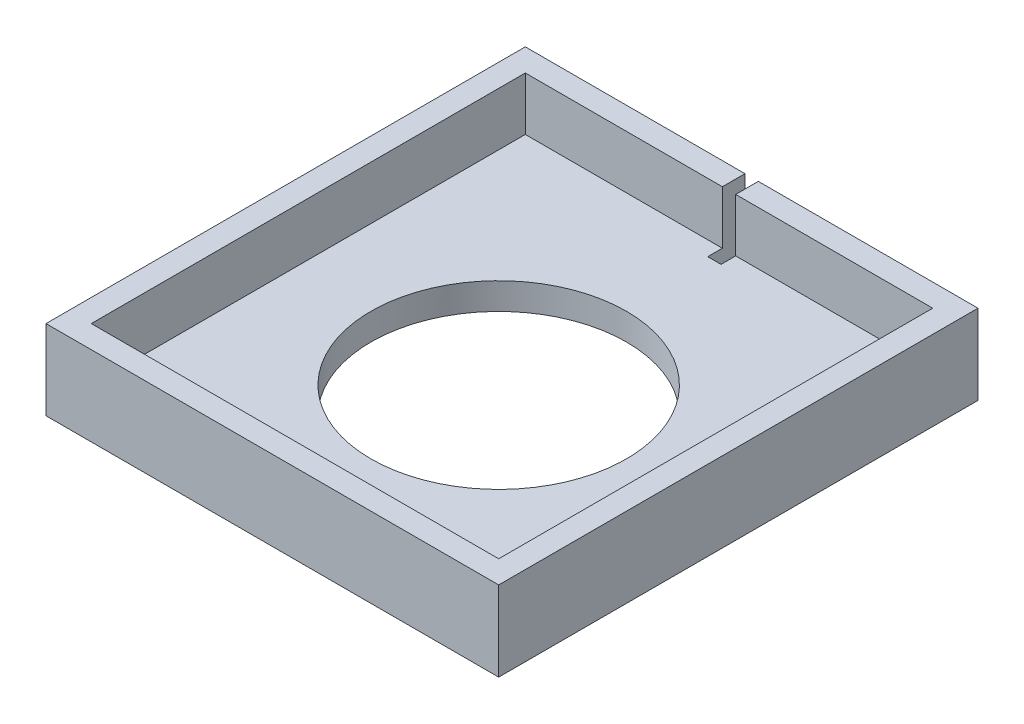
ISO-10303-21;
HEADER;
FILE_DESCRIPTION(('STEP AP214'),'2;1');
FILE_NAME('part.step','',(''),(''),'','','');
FILE_SCHEMA(('AUTOMOTIVE_DESIGN { 1 0 10303 214 1 1 1 1 }'));
ENDSEC;
DATA;
#1=APPLICATION_CONTEXT('core data for automotive mechanical design processes');
#2=APPLICATION_PROTOCOL_DEFINITION('international standard','automotive_design',2000,#1);
#3=PRODUCT_CONTEXT('',#1,'mechanical');
#4=PRODUCT('Part','Part','',(#3));
#5=PRODUCT_RELATED_PRODUCT_CATEGORY('part','',(#4));
#6=PRODUCT_DEFINITION_FORMATION('','',#4);
#7=PRODUCT_DEFINITION_CONTEXT('part definition',#1,'design');
#8=PRODUCT_DEFINITION('design','',#6,#7);
#9=PRODUCT_DEFINITION_SHAPE('','',#8);
#10=(LENGTH_UNIT() NAMED_UNIT(*) SI_UNIT(.MILLI.,.METRE.));
#11=(NAMED_UNIT(*) PLANE_ANGLE_UNIT() SI_UNIT($,.RADIAN.));
#12=(NAMED_UNIT(*) SI_UNIT($,.STERADIAN.) SOLID_ANGLE_UNIT());
#13=UNCERTAINTY_MEASURE_WITH_UNIT(LENGTH_MEASURE(1.E-05),#10,'distance_accuracy_value','');
#14=(GEOMETRIC_REPRESENTATION_CONTEXT(3) GLOBAL_UNCERTAINTY_ASSIGNED_CONTEXT((#13)) GLOBAL_UNIT_ASSIGNED_CONTEXT((#10,
#11,#12)) REPRESENTATION_CONTEXT('',''));
#15=CARTESIAN_POINT('',(0.,0.,0.));
#16=DIRECTION('',(0.,0.,1.));
#17=DIRECTION('',(1.,0.,0.));
#18=AXIS2_PLACEMENT_3D('',#15,#16,#17);
#19=CARTESIAN_POINT('',(0.,6.,-36.));
#20=DIRECTION('',(0.,0.,1.));
#21=DIRECTION('',(1.,0.,0.));
#22=AXIS2_PLACEMENT_3D('',#19,#20,#21);
#23=PLANE('',#22);
#24=DIRECTION('',(-1.,0.,0.));
#25=VECTOR('',#24,1.);
#26=CARTESIAN_POINT('',(0.,0.,-36.));
#27=LINE('',#26,#25);
#28=CARTESIAN_POINT('',(34.,0.,-36.));
#29=VERTEX_POINT('',#28);
#30=CARTESIAN_POINT('',(17.5,0.,-36.));
#31=VERTEX_POINT('',#30);
#32=EDGE_CURVE('E174',#29,#31,#27,.T.);
#33=ORIENTED_EDGE('',*,*,#32,.T.);
#34=DIRECTION('',(0.,-1.,0.));
#35=VECTOR('',#34,1.);
#36=CARTESIAN_POINT('',(17.5,6.,-36.));
#37=LINE('',#36,#35);
#38=CARTESIAN_POINT('',(17.5,6.,-36.));
#39=VERTEX_POINT('',#38);
#40=EDGE_CURVE('E142',#39,#31,#37,.T.);
#41=ORIENTED_EDGE('',*,*,#40,.F.);
#42=DIRECTION('',(-1.,0.,0.));
#43=VECTOR('',#42,1.);
#44=CARTESIAN_POINT('',(0.,6.,-36.));
#45=LINE('',#44,#43);
#46=CARTESIAN_POINT('',(34.,6.,-36.));
#47=VERTEX_POINT('',#46);
#48=EDGE_CURVE('E158',#47,#39,#45,.T.);
#49=ORIENTED_EDGE('',*,*,#48,.F.);
#50=DIRECTION('',(0.,-1.,0.));
#51=VECTOR('',#50,1.);
#52=CARTESIAN_POINT('',(34.,6.,-36.));
#53=LINE('',#52,#51);
#54=EDGE_CURVE('E179',#47,#29,#53,.T.);
#55=ORIENTED_EDGE('',*,*,#54,.T.);
#56=EDGE_LOOP('',(#33,#41,#49,#55));
#57=FACE_BOUND('',#56,.T.);
#58=ADVANCED_FACE('F32',(#57),#23,.F.);
#59=CARTESIAN_POINT('',(32.3,2.,-34.3));
#60=DIRECTION('',(0.,0.,-1.));
#61=DIRECTION('',(-1.,0.,0.));
#62=AXIS2_PLACEMENT_3D('',#59,#60,#61);
#63=PLANE('',#62);
#64=DIRECTION('',(-1.,0.,0.));
#65=VECTOR('',#64,1.);
#66=CARTESIAN_POINT('',(32.3,6.,-34.3));
#67=LINE('',#66,#65);
#68=CARTESIAN_POINT('',(32.3,6.,-34.3));
#69=VERTEX_POINT('',#68);
#70=CARTESIAN_POINT('',(17.5,6.,-34.3));
#71=VERTEX_POINT('',#70);
#72=EDGE_CURVE('E232',#69,#71,#67,.T.);
#73=ORIENTED_EDGE('',*,*,#72,.T.);
#74=DIRECTION('',(0.,-1.,0.));
#75=VECTOR('',#74,1.);
#76=CARTESIAN_POINT('',(17.5,2.,-34.3));
#77=LINE('',#76,#75);
#78=CARTESIAN_POINT('',(17.5,2.,-34.3));
#79=VERTEX_POINT('',#78);
#80=EDGE_CURVE('E215',#71,#79,#77,.T.);
#81=ORIENTED_EDGE('',*,*,#80,.T.);
#82=DIRECTION('',(-1.,0.,0.));
#83=VECTOR('',#82,1.);
#84=CARTESIAN_POINT('',(32.3,2.,-34.3));
#85=LINE('',#84,#83);
#86=CARTESIAN_POINT('',(32.3,2.,-34.3));
#87=VERTEX_POINT('',#86);
#88=EDGE_CURVE('E219',#87,#79,#85,.T.);
#89=ORIENTED_EDGE('',*,*,#88,.F.);
#90=DIRECTION('',(0.,1.,0.));
#91=VECTOR('',#90,1.);
#92=CARTESIAN_POINT('',(32.3,2.,-34.3));
#93=LINE('',#92,#91);
#94=EDGE_CURVE('E169',#87,#69,#93,.T.);
#95=ORIENTED_EDGE('',*,*,#94,.T.);
#96=EDGE_LOOP('',(#73,#81,#89,#95));
#97=FACE_BOUND('',#96,.T.);
#98=ADVANCED_FACE('F268',(#97),#63,.F.);
#99=CARTESIAN_POINT('',(0.,6.,0.));
#100=DIRECTION('',(1.,0.,0.));
#101=DIRECTION('',(0.,0.,-1.));
#102=AXIS2_PLACEMENT_3D('',#99,#100,#101);
#103=PLANE('',#102);
#104=DIRECTION('',(0.,0.,1.));
#105=VECTOR('',#104,1.);
#106=CARTESIAN_POINT('',(0.,0.,0.));
#107=LINE('',#106,#105);
#108=CARTESIAN_POINT('',(0.,0.,-36.));
#109=VERTEX_POINT('',#108);
#110=CARTESIAN_POINT('',(0.,0.,0.));
#111=VERTEX_POINT('',#110);
#112=EDGE_CURVE('E165',#109,#111,#107,.T.);
#113=ORIENTED_EDGE('',*,*,#112,.T.);
#114=DIRECTION('',(0.,-1.,0.));
#115=VECTOR('',#114,1.);
#116=CARTESIAN_POINT('',(0.,6.,0.));
#117=LINE('',#116,#115);
#118=CARTESIAN_POINT('',(0.,6.,0.));
#119=VERTEX_POINT('',#118);
#120=EDGE_CURVE('E185',#119,#111,#117,.T.);
#121=ORIENTED_EDGE('',*,*,#120,.F.);
#122=DIRECTION('',(0.,0.,1.));
#123=VECTOR('',#122,1.);
#124=CARTESIAN_POINT('',(0.,6.,0.));
#125=LINE('',#124,#123);
#126=CARTESIAN_POINT('',(0.,6.,-36.));
#127=VERTEX_POINT('',#126);
#128=EDGE_CURVE('E177',#127,#119,#125,.T.);
#129=ORIENTED_EDGE('',*,*,#128,.F.);
#130=DIRECTION('',(0.,-1.,0.));
#131=VECTOR('',#130,1.);
#132=CARTESIAN_POINT('',(0.,6.,-36.));
#133=LINE('',#132,#131);
#134=EDGE_CURVE('E156',#127,#109,#133,.T.);
#135=ORIENTED_EDGE('',*,*,#134,.T.);
#136=EDGE_LOOP('',(#113,#121,#129,#135));
#137=FACE_BOUND('',#136,.T.);
#138=ADVANCED_FACE('F34',(#137),#103,.F.);
#139=CARTESIAN_POINT('',(0.,6.,0.));
#140=DIRECTION('',(0.,0.,-1.));
#141=DIRECTION('',(-1.,0.,0.));
#142=AXIS2_PLACEMENT_3D('',#139,#140,#141);
#143=PLANE('',#142);
#144=DIRECTION('',(1.,0.,0.));
#145=VECTOR('',#144,1.);
#146=CARTESIAN_POINT('',(0.,0.,0.));
#147=LINE('',#146,#145);
#148=CARTESIAN_POINT('',(34.,0.,0.));
#149=VERTEX_POINT('',#148);
#150=EDGE_CURVE('E168',#111,#149,#147,.T.);
#151=ORIENTED_EDGE('',*,*,#150,.T.);
#152=DIRECTION('',(0.,-1.,0.));
#153=VECTOR('',#152,1.);
#154=CARTESIAN_POINT('',(34.,6.,0.));
#155=LINE('',#154,#153);
#156=CARTESIAN_POINT('',(34.,6.,0.));
#157=VERTEX_POINT('',#156);
#158=EDGE_CURVE('E182',#157,#149,#155,.T.);
#159=ORIENTED_EDGE('',*,*,#158,.F.);
#160=DIRECTION('',(1.,0.,0.));
#161=VECTOR('',#160,1.);
#162=CARTESIAN_POINT('',(0.,6.,0.));
#163=LINE('',#162,#161);
#164=EDGE_CURVE('E161',#119,#157,#163,.T.);
#165=ORIENTED_EDGE('',*,*,#164,.F.);
#166=ORIENTED_EDGE('',*,*,#120,.T.);
#167=EDGE_LOOP('',(#151,#159,#165,#166));
#168=FACE_BOUND('',#167,.T.);
#169=ADVANCED_FACE('F255',(#168),#143,.F.);
#170=CARTESIAN_POINT('',(34.,6.,0.));
#171=DIRECTION('',(-1.,0.,0.));
#172=DIRECTION('',(0.,0.,1.));
#173=AXIS2_PLACEMENT_3D('',#170,#171,#172);
#174=PLANE('',#173);
#175=DIRECTION('',(0.,0.,-1.));
#176=VECTOR('',#175,1.);
#177=CARTESIAN_POINT('',(34.,0.,0.));
#178=LINE('',#177,#176);
#179=EDGE_CURVE('E171',#149,#29,#178,.T.);
#180=ORIENTED_EDGE('',*,*,#179,.T.);
#181=ORIENTED_EDGE('',*,*,#54,.F.);
#182=DIRECTION('',(0.,0.,-1.));
#183=VECTOR('',#182,1.);
#184=CARTESIAN_POINT('',(34.,6.,0.));
#185=LINE('',#184,#183);
#186=EDGE_CURVE('E159',#157,#47,#185,.T.);
#187=ORIENTED_EDGE('',*,*,#186,.F.);
#188=ORIENTED_EDGE('',*,*,#158,.T.);
#189=EDGE_LOOP('',(#180,#181,#187,#188));
#190=FACE_BOUND('',#189,.T.);
#191=ADVANCED_FACE('F258',(#190),#174,.F.);
#192=CARTESIAN_POINT('',(16.5,6.,-36.));
#193=VERTEX_POINT('',#192);
#194=EDGE_CURVE('E148',#193,#127,#45,.T.);
#195=ORIENTED_EDGE('',*,*,#194,.F.);
#196=DIRECTION('',(0.,-1.,0.));
#197=VECTOR('',#196,1.);
#198=CARTESIAN_POINT('',(16.5,6.,-36.));
#199=LINE('',#198,#197);
#200=CARTESIAN_POINT('',(16.5,0.,-36.));
#201=VERTEX_POINT('',#200);
#202=EDGE_CURVE('E133',#193,#201,#199,.T.);
#203=ORIENTED_EDGE('',*,*,#202,.T.);
#204=EDGE_CURVE('E173',#201,#109,#27,.T.);
#205=ORIENTED_EDGE('',*,*,#204,.T.);
#206=ORIENTED_EDGE('',*,*,#134,.F.);
#207=EDGE_LOOP('',(#195,#203,#205,#206));
#208=FACE_BOUND('',#207,.T.);
#209=ADVANCED_FACE('F154',(#208),#23,.F.);
#210=CARTESIAN_POINT('',(0.,6.,0.));
#211=DIRECTION('',(0.,-1.,0.));
#212=DIRECTION('',(0.,0.,-1.));
#213=AXIS2_PLACEMENT_3D('',#210,#211,#212);
#214=PLANE('',#213);
#215=ORIENTED_EDGE('',*,*,#48,.T.);
#216=DIRECTION('',(0.,0.,1.));
#217=VECTOR('',#216,1.);
#218=CARTESIAN_POINT('',(17.5,6.,-36.));
#219=LINE('',#218,#217);
#220=EDGE_CURVE('E152',#39,#71,#219,.T.);
#221=ORIENTED_EDGE('',*,*,#220,.T.);
#222=ORIENTED_EDGE('',*,*,#72,.F.);
#223=DIRECTION('',(0.,0.,-1.));
#224=VECTOR('',#223,1.);
#225=CARTESIAN_POINT('',(32.3,6.,-1.7));
#226=LINE('',#225,#224);
#227=CARTESIAN_POINT('',(32.3,6.,-1.7));
#228=VERTEX_POINT('',#227);
#229=EDGE_CURVE('E241',#228,#69,#226,.T.);
#230=ORIENTED_EDGE('',*,*,#229,.F.);
#231=DIRECTION('',(1.,0.,0.));
#232=VECTOR('',#231,1.);
#233=CARTESIAN_POINT('',(1.7,6.,-1.7));
#234=LINE('',#233,#232);
#235=CARTESIAN_POINT('',(1.7,6.,-1.7));
#236=VERTEX_POINT('',#235);
#237=EDGE_CURVE('E238',#236,#228,#234,.T.);
#238=ORIENTED_EDGE('',*,*,#237,.F.);
#239=DIRECTION('',(0.,0.,1.));
#240=VECTOR('',#239,1.);
#241=CARTESIAN_POINT('',(1.7,6.,-34.3));
#242=LINE('',#241,#240);
#243=CARTESIAN_POINT('',(1.7,6.,-34.3));
#244=VERTEX_POINT('',#243);
#245=EDGE_CURVE('E235',#244,#236,#242,.T.);
#246=ORIENTED_EDGE('',*,*,#245,.F.);
#247=CARTESIAN_POINT('',(16.5,6.,-34.3));
#248=VERTEX_POINT('',#247);
#249=EDGE_CURVE('E55',#248,#244,#67,.T.);
#250=ORIENTED_EDGE('',*,*,#249,.F.);
#251=DIRECTION('',(0.,0.,-1.));
#252=VECTOR('',#251,1.);
#253=CARTESIAN_POINT('',(16.5,6.,-36.));
#254=LINE('',#253,#252);
#255=EDGE_CURVE('E136',#248,#193,#254,.T.);
#256=ORIENTED_EDGE('',*,*,#255,.T.);
#257=ORIENTED_EDGE('',*,*,#194,.T.);
#258=ORIENTED_EDGE('',*,*,#128,.T.);
#259=ORIENTED_EDGE('',*,*,#164,.T.);
#260=ORIENTED_EDGE('',*,*,#186,.T.);
#261=EDGE_LOOP('',(#215,#221,#222,#230,#238,#246,#250,#256,#257,#258,#259,#260));
#262=FACE_BOUND('',#261,.T.);
#263=ADVANCED_FACE('F146',(#262),#214,.F.);
#264=CARTESIAN_POINT('',(0.,0.,0.));
#265=DIRECTION('',(0.,-1.,0.));
#266=DIRECTION('',(0.,0.,-1.));
#267=AXIS2_PLACEMENT_3D('',#264,#265,#266);
#268=PLANE('',#267);
#269=DIRECTION('',(0.,0.,1.));
#270=VECTOR('',#269,1.);
#271=CARTESIAN_POINT('',(17.5,0.,-36.));
#272=LINE('',#271,#270);
#273=CARTESIAN_POINT('',(17.5,0.,-33.2));
#274=VERTEX_POINT('',#273);
#275=EDGE_CURVE('E209',#31,#274,#272,.T.);
#276=ORIENTED_EDGE('',*,*,#275,.F.);
#277=ORIENTED_EDGE('',*,*,#32,.F.);
#278=ORIENTED_EDGE('',*,*,#179,.F.);
#279=ORIENTED_EDGE('',*,*,#150,.F.);
#280=ORIENTED_EDGE('',*,*,#112,.F.);
#281=ORIENTED_EDGE('',*,*,#204,.F.);
#282=DIRECTION('',(0.,0.,-1.));
#283=VECTOR('',#282,1.);
#284=CARTESIAN_POINT('',(16.5,0.,-36.));
#285=LINE('',#284,#283);
#286=CARTESIAN_POINT('',(16.5,0.,-33.2));
#287=VERTEX_POINT('',#286);
#288=EDGE_CURVE('E138',#287,#201,#285,.T.);
#289=ORIENTED_EDGE('',*,*,#288,.F.);
#290=DIRECTION('',(-1.,0.,0.));
#291=VECTOR('',#290,1.);
#292=CARTESIAN_POINT('',(17.5,0.,-33.2));
#293=LINE('',#292,#291);
#294=EDGE_CURVE('E317',#274,#287,#293,.T.);
#295=ORIENTED_EDGE('',*,*,#294,.F.);
#296=EDGE_LOOP('',(#276,#277,#278,#279,#280,#281,#289,#295));
#297=FACE_BOUND('',#296,.T.);
#298=CARTESIAN_POINT('',(17.,0.,-17.));
#299=DIRECTION('',(0.,-1.,0.));
#300=DIRECTION('',(0.,0.,-1.));
#301=AXIS2_PLACEMENT_3D('',#298,#299,#300);
#302=CIRCLE('',#301,9.6);
#303=CARTESIAN_POINT('',(17.,0.,-26.6));
#304=VERTEX_POINT('',#303);
#305=EDGE_CURVE('E192',#304,#304,#302,.T.);
#306=ORIENTED_EDGE('',*,*,#305,.F.);
#307=EDGE_LOOP('',(#306));
#308=FACE_BOUND('',#307,.T.);
#309=ADVANCED_FACE('F282',(#297,#308),#268,.T.);
#310=CARTESIAN_POINT('',(16.5,2.,-34.3));
#311=VERTEX_POINT('',#310);
#312=CARTESIAN_POINT('',(1.7,2.,-34.3));
#313=VERTEX_POINT('',#312);
#314=EDGE_CURVE('E222',#311,#313,#85,.T.);
#315=ORIENTED_EDGE('',*,*,#314,.F.);
#316=DIRECTION('',(0.,1.,0.));
#317=VECTOR('',#316,1.);
#318=CARTESIAN_POINT('',(16.5,2.,-34.3));
#319=LINE('',#318,#317);
#320=EDGE_CURVE('E195',#311,#248,#319,.T.);
#321=ORIENTED_EDGE('',*,*,#320,.T.);
#322=ORIENTED_EDGE('',*,*,#249,.T.);
#323=DIRECTION('',(0.,1.,0.));
#324=VECTOR('',#323,1.);
#325=CARTESIAN_POINT('',(1.7,2.,-34.3));
#326=LINE('',#325,#324);
#327=EDGE_CURVE('E231',#313,#244,#326,.T.);
#328=ORIENTED_EDGE('',*,*,#327,.F.);
#329=EDGE_LOOP('',(#315,#321,#322,#328));
#330=FACE_BOUND('',#329,.T.);
#331=ADVANCED_FACE('F280',(#330),#63,.F.);
#332=CARTESIAN_POINT('',(32.3,2.,-1.7));
#333=DIRECTION('',(1.,0.,0.));
#334=DIRECTION('',(0.,0.,-1.));
#335=AXIS2_PLACEMENT_3D('',#332,#333,#334);
#336=PLANE('',#335);
#337=ORIENTED_EDGE('',*,*,#229,.T.);
#338=ORIENTED_EDGE('',*,*,#94,.F.);
#339=DIRECTION('',(0.,0.,-1.));
#340=VECTOR('',#339,1.);
#341=CARTESIAN_POINT('',(32.3,2.,-1.7));
#342=LINE('',#341,#340);
#343=CARTESIAN_POINT('',(32.3,2.,-1.7));
#344=VERTEX_POINT('',#343);
#345=EDGE_CURVE('E228',#344,#87,#342,.T.);
#346=ORIENTED_EDGE('',*,*,#345,.F.);
#347=DIRECTION('',(0.,1.,0.));
#348=VECTOR('',#347,1.);
#349=CARTESIAN_POINT('',(32.3,2.,-1.7));
#350=LINE('',#349,#348);
#351=EDGE_CURVE('E245',#344,#228,#350,.T.);
#352=ORIENTED_EDGE('',*,*,#351,.T.);
#353=EDGE_LOOP('',(#337,#338,#346,#352));
#354=FACE_BOUND('',#353,.T.);
#355=ADVANCED_FACE('F272',(#354),#336,.F.);
#356=CARTESIAN_POINT('',(1.7,2.,-1.7));
#357=DIRECTION('',(0.,0.,1.));
#358=DIRECTION('',(1.,0.,0.));
#359=AXIS2_PLACEMENT_3D('',#356,#357,#358);
#360=PLANE('',#359);
#361=ORIENTED_EDGE('',*,*,#237,.T.);
#362=ORIENTED_EDGE('',*,*,#351,.F.);
#363=DIRECTION('',(1.,0.,0.));
#364=VECTOR('',#363,1.);
#365=CARTESIAN_POINT('',(1.7,2.,-1.7));
#366=LINE('',#365,#364);
#367=CARTESIAN_POINT('',(1.7,2.,-1.7));
#368=VERTEX_POINT('',#367);
#369=EDGE_CURVE('E225',#368,#344,#366,.T.);
#370=ORIENTED_EDGE('',*,*,#369,.F.);
#371=DIRECTION('',(0.,1.,0.));
#372=VECTOR('',#371,1.);
#373=CARTESIAN_POINT('',(1.7,2.,-1.7));
#374=LINE('',#373,#372);
#375=EDGE_CURVE('E247',#368,#236,#374,.T.);
#376=ORIENTED_EDGE('',*,*,#375,.T.);
#377=EDGE_LOOP('',(#361,#362,#370,#376));
#378=FACE_BOUND('',#377,.T.);
#379=ADVANCED_FACE('F275',(#378),#360,.F.);
#380=CARTESIAN_POINT('',(1.7,2.,-34.3));
#381=DIRECTION('',(-1.,0.,0.));
#382=DIRECTION('',(0.,0.,1.));
#383=AXIS2_PLACEMENT_3D('',#380,#381,#382);
#384=PLANE('',#383);
#385=ORIENTED_EDGE('',*,*,#245,.T.);
#386=ORIENTED_EDGE('',*,*,#375,.F.);
#387=DIRECTION('',(0.,0.,1.));
#388=VECTOR('',#387,1.);
#389=CARTESIAN_POINT('',(1.7,2.,-34.3));
#390=LINE('',#389,#388);
#391=EDGE_CURVE('E221',#313,#368,#390,.T.);
#392=ORIENTED_EDGE('',*,*,#391,.F.);
#393=ORIENTED_EDGE('',*,*,#327,.T.);
#394=EDGE_LOOP('',(#385,#386,#392,#393));
#395=FACE_BOUND('',#394,.T.);
#396=ADVANCED_FACE('F279',(#395),#384,.F.);
#397=CARTESIAN_POINT('',(0.,2.,0.));
#398=DIRECTION('',(0.,1.,0.));
#399=DIRECTION('',(0.,0.,1.));
#400=AXIS2_PLACEMENT_3D('',#397,#398,#399);
#401=PLANE('',#400);
#402=DIRECTION('',(0.,0.,-1.));
#403=VECTOR('',#402,1.);
#404=CARTESIAN_POINT('',(17.5,2.,0.));
#405=LINE('',#404,#403);
#406=CARTESIAN_POINT('',(17.5,2.,-33.2));
#407=VERTEX_POINT('',#406);
#408=EDGE_CURVE('E11',#407,#79,#405,.T.);
#409=ORIENTED_EDGE('',*,*,#408,.F.);
#410=DIRECTION('',(1.,0.,0.));
#411=VECTOR('',#410,1.);
#412=CARTESIAN_POINT('',(0.,2.,-33.2));
#413=LINE('',#412,#411);
#414=CARTESIAN_POINT('',(16.5,2.,-33.2));
#415=VERTEX_POINT('',#414);
#416=EDGE_CURVE('E188',#415,#407,#413,.T.);
#417=ORIENTED_EDGE('',*,*,#416,.F.);
#418=DIRECTION('',(0.,0.,1.));
#419=VECTOR('',#418,1.);
#420=CARTESIAN_POINT('',(16.5,2.,0.));
#421=LINE('',#420,#419);
#422=EDGE_CURVE('E40',#311,#415,#421,.T.);
#423=ORIENTED_EDGE('',*,*,#422,.F.);
#424=ORIENTED_EDGE('',*,*,#314,.T.);
#425=ORIENTED_EDGE('',*,*,#391,.T.);
#426=ORIENTED_EDGE('',*,*,#369,.T.);
#427=ORIENTED_EDGE('',*,*,#345,.T.);
#428=ORIENTED_EDGE('',*,*,#88,.T.);
#429=EDGE_LOOP('',(#409,#417,#423,#424,#425,#426,#427,#428));
#430=FACE_BOUND('',#429,.T.);
#431=CARTESIAN_POINT('',(17.,2.,-17.));
#432=DIRECTION('',(0.,1.,0.));
#433=DIRECTION('',(0.,0.,1.));
#434=AXIS2_PLACEMENT_3D('',#431,#432,#433);
#435=CIRCLE('',#434,9.6);
#436=CARTESIAN_POINT('',(17.,2.,-7.4));
#437=VERTEX_POINT('',#436);
#438=EDGE_CURVE('E189',#437,#437,#435,.T.);
#439=ORIENTED_EDGE('',*,*,#438,.F.);
#440=EDGE_LOOP('',(#439));
#441=FACE_BOUND('',#440,.T.);
#442=ADVANCED_FACE('F199',(#430,#441),#401,.T.);
#443=CARTESIAN_POINT('',(17.,6.,-17.));
#444=DIRECTION('',(0.,-1.,0.));
#445=DIRECTION('',(0.,0.,-1.));
#446=AXIS2_PLACEMENT_3D('',#443,#444,#445);
#447=CYLINDRICAL_SURFACE('',#446,9.6);
#448=ORIENTED_EDGE('',*,*,#438,.T.);
#449=EDGE_LOOP('',(#448));
#450=FACE_BOUND('',#449,.T.);
#451=ORIENTED_EDGE('',*,*,#305,.T.);
#452=EDGE_LOOP('',(#451));
#453=FACE_BOUND('',#452,.T.);
#454=ADVANCED_FACE('F324',(#450,#453),#447,.F.);
#455=CARTESIAN_POINT('',(17.5,6.,-36.));
#456=DIRECTION('',(1.,0.,0.));
#457=DIRECTION('',(0.,0.,-1.));
#458=AXIS2_PLACEMENT_3D('',#455,#456,#457);
#459=PLANE('',#458);
#460=ORIENTED_EDGE('',*,*,#220,.F.);
#461=ORIENTED_EDGE('',*,*,#40,.T.);
#462=ORIENTED_EDGE('',*,*,#275,.T.);
#463=DIRECTION('',(0.,-1.,0.));
#464=VECTOR('',#463,1.);
#465=CARTESIAN_POINT('',(17.5,6.,-33.2));
#466=LINE('',#465,#464);
#467=EDGE_CURVE('E151',#407,#274,#466,.T.);
#468=ORIENTED_EDGE('',*,*,#467,.F.);
#469=ORIENTED_EDGE('',*,*,#408,.T.);
#470=ORIENTED_EDGE('',*,*,#80,.F.);
#471=EDGE_LOOP('',(#460,#461,#462,#468,#469,#470));
#472=FACE_BOUND('',#471,.T.);
#473=ADVANCED_FACE('F206',(#472),#459,.F.);
#474=CARTESIAN_POINT('',(16.5,6.,-36.));
#475=DIRECTION('',(-1.,0.,0.));
#476=DIRECTION('',(0.,0.,1.));
#477=AXIS2_PLACEMENT_3D('',#474,#475,#476);
#478=PLANE('',#477);
#479=ORIENTED_EDGE('',*,*,#422,.T.);
#480=DIRECTION('',(0.,-1.,0.));
#481=VECTOR('',#480,1.);
#482=CARTESIAN_POINT('',(16.5,6.,-33.2));
#483=LINE('',#482,#481);
#484=EDGE_CURVE('E47',#415,#287,#483,.T.);
#485=ORIENTED_EDGE('',*,*,#484,.T.);
#486=ORIENTED_EDGE('',*,*,#288,.T.);
#487=ORIENTED_EDGE('',*,*,#202,.F.);
#488=ORIENTED_EDGE('',*,*,#255,.F.);
#489=ORIENTED_EDGE('',*,*,#320,.F.);
#490=EDGE_LOOP('',(#479,#485,#486,#487,#488,#489));
#491=FACE_BOUND('',#490,.T.);
#492=ADVANCED_FACE('F135',(#491),#478,.F.);
#493=CARTESIAN_POINT('',(17.5,6.,-33.2));
#494=DIRECTION('',(0.,0.,1.));
#495=DIRECTION('',(1.,0.,0.));
#496=AXIS2_PLACEMENT_3D('',#493,#494,#495);
#497=PLANE('',#496);
#498=ORIENTED_EDGE('',*,*,#416,.T.);
#499=ORIENTED_EDGE('',*,*,#467,.T.);
#500=ORIENTED_EDGE('',*,*,#294,.T.);
#501=ORIENTED_EDGE('',*,*,#484,.F.);
#502=EDGE_LOOP('',(#498,#499,#500,#501));
#503=FACE_BOUND('',#502,.T.);
#504=ADVANCED_FACE('F203',(#503),#497,.F.);
#505=CLOSED_SHELL('',(#58,#98,#138,#169,#191,#209,#263,#309,#331,#355,#379,#396,#442,#454,#473,
#492,#504));
#506=MANIFOLD_SOLID_BREP('B2',#505);
#507=ADVANCED_BREP_SHAPE_REPRESENTATION('',(#18,#506),#14);
#508=SHAPE_DEFINITION_REPRESENTATION(#9,#507);
ENDSEC;
END-ISO-10303-21;
